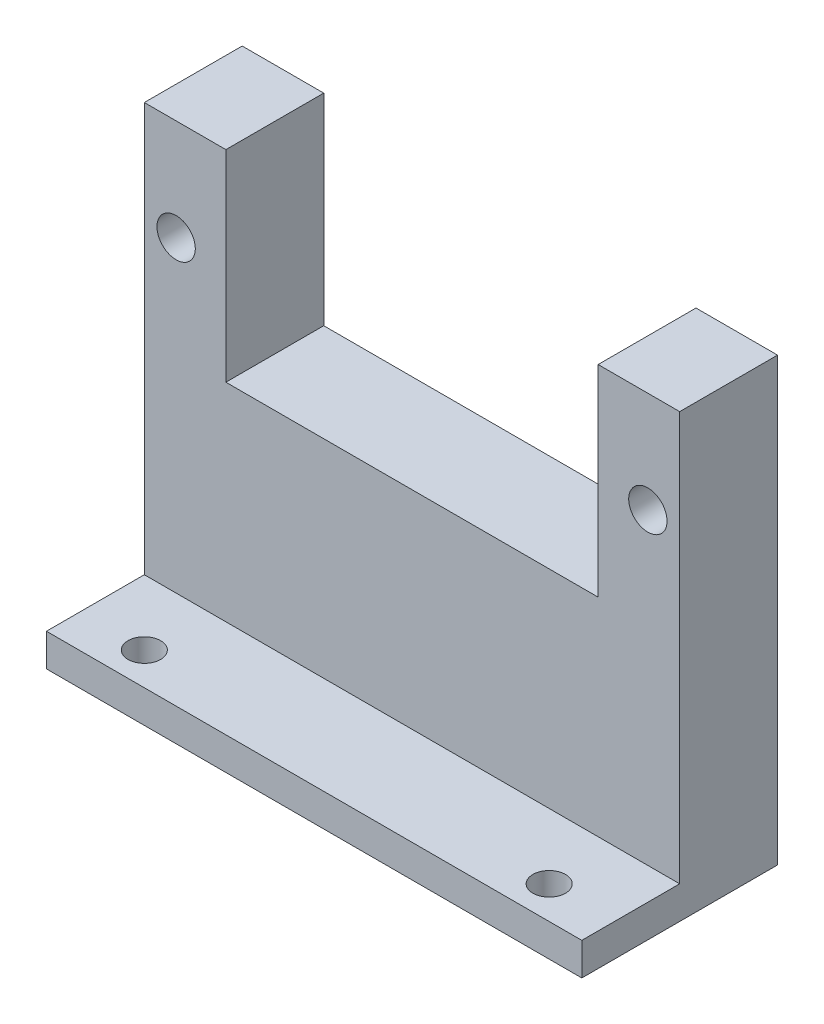
ISO-10303-21;
HEADER;
FILE_DESCRIPTION(('STEP AP214'),'2;1');
FILE_NAME('part.step','',(''),(''),'','','');
FILE_SCHEMA(('AUTOMOTIVE_DESIGN { 1 0 10303 214 1 1 1 1 }'));
ENDSEC;
DATA;
#1=APPLICATION_CONTEXT('core data for automotive mechanical design processes');
#2=APPLICATION_PROTOCOL_DEFINITION('international standard','automotive_design',2000,#1);
#3=PRODUCT_CONTEXT('',#1,'mechanical');
#4=PRODUCT('Part','Part','',(#3));
#5=PRODUCT_RELATED_PRODUCT_CATEGORY('part','',(#4));
#6=PRODUCT_DEFINITION_FORMATION('','',#4);
#7=PRODUCT_DEFINITION_CONTEXT('part definition',#1,'design');
#8=PRODUCT_DEFINITION('design','',#6,#7);
#9=PRODUCT_DEFINITION_SHAPE('','',#8);
#10=(LENGTH_UNIT() NAMED_UNIT(*) SI_UNIT(.MILLI.,.METRE.));
#11=(NAMED_UNIT(*) PLANE_ANGLE_UNIT() SI_UNIT($,.RADIAN.));
#12=(NAMED_UNIT(*) SI_UNIT($,.STERADIAN.) SOLID_ANGLE_UNIT());
#13=UNCERTAINTY_MEASURE_WITH_UNIT(LENGTH_MEASURE(1.E-05),#10,'distance_accuracy_value','');
#14=(GEOMETRIC_REPRESENTATION_CONTEXT(3) GLOBAL_UNCERTAINTY_ASSIGNED_CONTEXT((#13)) GLOBAL_UNIT_ASSIGNED_CONTEXT((#10,
#11,#12)) REPRESENTATION_CONTEXT('',''));
#15=CARTESIAN_POINT('',(0.,0.,0.));
#16=DIRECTION('',(0.,0.,1.));
#17=DIRECTION('',(1.,0.,0.));
#18=AXIS2_PLACEMENT_3D('',#15,#16,#17);
#19=CARTESIAN_POINT('',(0.,0.,6.));
#20=DIRECTION('',(0.,0.,-1.));
#21=DIRECTION('',(-1.,0.,0.));
#22=AXIS2_PLACEMENT_3D('',#19,#20,#21);
#23=PLANE('',#22);
#24=CARTESIAN_POINT('',(1.95,20.87,6.));
#25=DIRECTION('',(0.,0.,1.));
#26=DIRECTION('',(-1.,0.,0.));
#27=AXIS2_PLACEMENT_3D('',#24,#25,#26);
#28=CIRCLE('',#27,1.175);
#29=CARTESIAN_POINT('',(0.774999999999999,20.87,6.));
#30=VERTEX_POINT('',#29);
#31=EDGE_CURVE('E197',#30,#30,#28,.T.);
#32=ORIENTED_EDGE('',*,*,#31,.F.);
#33=EDGE_LOOP('',(#32));
#34=FACE_BOUND('',#33,.T.);
#35=CARTESIAN_POINT('',(30.87,20.87,6.));
#36=DIRECTION('',(0.,0.,1.));
#37=DIRECTION('',(1.,0.,0.));
#38=AXIS2_PLACEMENT_3D('',#35,#36,#37);
#39=CIRCLE('',#38,1.17499999999999);
#40=CARTESIAN_POINT('',(32.045,20.87,6.));
#41=VERTEX_POINT('',#40);
#42=EDGE_CURVE('E139',#41,#41,#39,.T.);
#43=ORIENTED_EDGE('',*,*,#42,.F.);
#44=EDGE_LOOP('',(#43));
#45=FACE_BOUND('',#44,.T.);
#46=DIRECTION('',(-1.,0.,0.));
#47=VECTOR('',#46,1.);
#48=CARTESIAN_POINT('',(0.,2.,6.));
#49=LINE('',#48,#47);
#50=CARTESIAN_POINT('',(32.82,2.,6.));
#51=VERTEX_POINT('',#50);
#52=CARTESIAN_POINT('',(0.,2.,6.));
#53=VERTEX_POINT('',#52);
#54=EDGE_CURVE('E48',#51,#53,#49,.T.);
#55=ORIENTED_EDGE('',*,*,#54,.F.);
#56=DIRECTION('',(0.,1.,0.));
#57=VECTOR('',#56,1.);
#58=CARTESIAN_POINT('',(32.82,0.,6.));
#59=LINE('',#58,#57);
#60=CARTESIAN_POINT('',(32.82,27.07,6.));
#61=VERTEX_POINT('',#60);
#62=EDGE_CURVE('E95',#51,#61,#59,.T.);
#63=ORIENTED_EDGE('',*,*,#62,.T.);
#64=DIRECTION('',(-1.,0.,0.));
#65=VECTOR('',#64,1.);
#66=CARTESIAN_POINT('',(32.82,27.07,6.));
#67=LINE('',#66,#65);
#68=CARTESIAN_POINT('',(27.82,27.07,6.));
#69=VERTEX_POINT('',#68);
#70=EDGE_CURVE('E209',#61,#69,#67,.T.);
#71=ORIENTED_EDGE('',*,*,#70,.T.);
#72=DIRECTION('',(0.,-1.,0.));
#73=VECTOR('',#72,1.);
#74=CARTESIAN_POINT('',(27.82,14.72,6.));
#75=LINE('',#74,#73);
#76=CARTESIAN_POINT('',(27.82,14.72,6.));
#77=VERTEX_POINT('',#76);
#78=EDGE_CURVE('E112',#69,#77,#75,.T.);
#79=ORIENTED_EDGE('',*,*,#78,.T.);
#80=DIRECTION('',(-1.,0.,0.));
#81=VECTOR('',#80,1.);
#82=CARTESIAN_POINT('',(5.,14.72,6.));
#83=LINE('',#82,#81);
#84=CARTESIAN_POINT('',(5.,14.72,6.));
#85=VERTEX_POINT('',#84);
#86=EDGE_CURVE('E106',#77,#85,#83,.T.);
#87=ORIENTED_EDGE('',*,*,#86,.T.);
#88=DIRECTION('',(0.,1.,0.));
#89=VECTOR('',#88,1.);
#90=CARTESIAN_POINT('',(5.,14.72,6.));
#91=LINE('',#90,#89);
#92=CARTESIAN_POINT('',(5.,27.07,6.));
#93=VERTEX_POINT('',#92);
#94=EDGE_CURVE('E109',#85,#93,#91,.T.);
#95=ORIENTED_EDGE('',*,*,#94,.T.);
#96=DIRECTION('',(-1.,0.,0.));
#97=VECTOR('',#96,1.);
#98=CARTESIAN_POINT('',(0.,27.07,6.));
#99=LINE('',#98,#97);
#100=CARTESIAN_POINT('',(0.,27.07,6.));
#101=VERTEX_POINT('',#100);
#102=EDGE_CURVE('E129',#93,#101,#99,.T.);
#103=ORIENTED_EDGE('',*,*,#102,.T.);
#104=DIRECTION('',(0.,-1.,0.));
#105=VECTOR('',#104,1.);
#106=CARTESIAN_POINT('',(0.,0.,6.));
#107=LINE('',#106,#105);
#108=EDGE_CURVE('E56',#101,#53,#107,.T.);
#109=ORIENTED_EDGE('',*,*,#108,.T.);
#110=EDGE_LOOP('',(#55,#63,#71,#79,#87,#95,#103,#109));
#111=FACE_BOUND('',#110,.T.);
#112=ADVANCED_FACE('F33',(#34,#45,#111),#23,.F.);
#113=CARTESIAN_POINT('',(0.,0.,0.));
#114=DIRECTION('',(0.,0.,-1.));
#115=DIRECTION('',(-1.,0.,0.));
#116=AXIS2_PLACEMENT_3D('',#113,#114,#115);
#117=PLANE('',#116);
#118=CARTESIAN_POINT('',(30.87,20.87,0.));
#119=DIRECTION('',(0.,0.,1.));
#120=DIRECTION('',(1.,0.,0.));
#121=AXIS2_PLACEMENT_3D('',#118,#119,#120);
#122=CIRCLE('',#121,1.17499999999999);
#123=CARTESIAN_POINT('',(32.045,20.87,0.));
#124=VERTEX_POINT('',#123);
#125=EDGE_CURVE('E200',#124,#124,#122,.T.);
#126=ORIENTED_EDGE('',*,*,#125,.T.);
#127=EDGE_LOOP('',(#126));
#128=FACE_BOUND('',#127,.T.);
#129=DIRECTION('',(1.,0.,0.));
#130=VECTOR('',#129,1.);
#131=CARTESIAN_POINT('',(0.,0.,0.));
#132=LINE('',#131,#130);
#133=CARTESIAN_POINT('',(0.,0.,0.));
#134=VERTEX_POINT('',#133);
#135=CARTESIAN_POINT('',(32.82,0.,0.));
#136=VERTEX_POINT('',#135);
#137=EDGE_CURVE('E135',#134,#136,#132,.T.);
#138=ORIENTED_EDGE('',*,*,#137,.F.);
#139=DIRECTION('',(0.,-1.,0.));
#140=VECTOR('',#139,1.);
#141=CARTESIAN_POINT('',(0.,20.,0.));
#142=LINE('',#141,#140);
#143=CARTESIAN_POINT('',(0.,27.07,0.));
#144=VERTEX_POINT('',#143);
#145=EDGE_CURVE('E149',#144,#134,#142,.T.);
#146=ORIENTED_EDGE('',*,*,#145,.F.);
#147=DIRECTION('',(-1.,0.,0.));
#148=VECTOR('',#147,1.);
#149=CARTESIAN_POINT('',(0.,27.07,0.));
#150=LINE('',#149,#148);
#151=CARTESIAN_POINT('',(5.,27.07,0.));
#152=VERTEX_POINT('',#151);
#153=EDGE_CURVE('E91',#152,#144,#150,.T.);
#154=ORIENTED_EDGE('',*,*,#153,.F.);
#155=DIRECTION('',(0.,1.,0.));
#156=VECTOR('',#155,1.);
#157=CARTESIAN_POINT('',(5.,14.72,0.));
#158=LINE('',#157,#156);
#159=CARTESIAN_POINT('',(5.,14.72,0.));
#160=VERTEX_POINT('',#159);
#161=EDGE_CURVE('E146',#160,#152,#158,.T.);
#162=ORIENTED_EDGE('',*,*,#161,.F.);
#163=DIRECTION('',(-1.,0.,0.));
#164=VECTOR('',#163,1.);
#165=CARTESIAN_POINT('',(5.,14.72,0.));
#166=LINE('',#165,#164);
#167=CARTESIAN_POINT('',(27.82,14.72,0.));
#168=VERTEX_POINT('',#167);
#169=EDGE_CURVE('E121',#168,#160,#166,.T.);
#170=ORIENTED_EDGE('',*,*,#169,.F.);
#171=DIRECTION('',(0.,-1.,0.));
#172=VECTOR('',#171,1.);
#173=CARTESIAN_POINT('',(27.82,14.72,0.));
#174=LINE('',#173,#172);
#175=CARTESIAN_POINT('',(27.82,27.07,0.));
#176=VERTEX_POINT('',#175);
#177=EDGE_CURVE('E143',#176,#168,#174,.T.);
#178=ORIENTED_EDGE('',*,*,#177,.F.);
#179=DIRECTION('',(-1.,0.,0.));
#180=VECTOR('',#179,1.);
#181=CARTESIAN_POINT('',(32.82,27.07,0.));
#182=LINE('',#181,#180);
#183=CARTESIAN_POINT('',(32.82,27.07,0.));
#184=VERTEX_POINT('',#183);
#185=EDGE_CURVE('E141',#184,#176,#182,.T.);
#186=ORIENTED_EDGE('',*,*,#185,.F.);
#187=DIRECTION('',(0.,1.,0.));
#188=VECTOR('',#187,1.);
#189=CARTESIAN_POINT('',(32.82,14.72,0.));
#190=LINE('',#189,#188);
#191=EDGE_CURVE('E138',#136,#184,#190,.T.);
#192=ORIENTED_EDGE('',*,*,#191,.F.);
#193=EDGE_LOOP('',(#138,#146,#154,#162,#170,#178,#186,#192));
#194=FACE_BOUND('',#193,.T.);
#195=CARTESIAN_POINT('',(1.95,20.87,0.));
#196=DIRECTION('',(0.,0.,1.));
#197=DIRECTION('',(-1.,0.,0.));
#198=AXIS2_PLACEMENT_3D('',#195,#196,#197);
#199=CIRCLE('',#198,1.175);
#200=CARTESIAN_POINT('',(0.774999999999999,20.87,0.));
#201=VERTEX_POINT('',#200);
#202=EDGE_CURVE('E196',#201,#201,#199,.T.);
#203=ORIENTED_EDGE('',*,*,#202,.T.);
#204=EDGE_LOOP('',(#203));
#205=FACE_BOUND('',#204,.T.);
#206=ADVANCED_FACE('F219',(#128,#194,#205),#117,.T.);
#207=CARTESIAN_POINT('',(0.,0.,6.));
#208=DIRECTION('',(0.,1.,0.));
#209=DIRECTION('',(-1.,0.,0.));
#210=AXIS2_PLACEMENT_3D('',#207,#208,#209);
#211=PLANE('',#210);
#212=ORIENTED_EDGE('',*,*,#137,.T.);
#213=DIRECTION('',(0.,0.,-1.));
#214=VECTOR('',#213,1.);
#215=CARTESIAN_POINT('',(32.82,0.,6.));
#216=LINE('',#215,#214);
#217=CARTESIAN_POINT('',(32.82,0.,12.));
#218=VERTEX_POINT('',#217);
#219=EDGE_CURVE('E41',#218,#136,#216,.T.);
#220=ORIENTED_EDGE('',*,*,#219,.F.);
#221=DIRECTION('',(1.,0.,0.));
#222=VECTOR('',#221,1.);
#223=CARTESIAN_POINT('',(0.,0.,12.));
#224=LINE('',#223,#222);
#225=CARTESIAN_POINT('',(0.,0.,12.));
#226=VERTEX_POINT('',#225);
#227=EDGE_CURVE('E172',#226,#218,#224,.T.);
#228=ORIENTED_EDGE('',*,*,#227,.F.);
#229=DIRECTION('',(0.,0.,-1.));
#230=VECTOR('',#229,1.);
#231=CARTESIAN_POINT('',(0.,0.,6.));
#232=LINE('',#231,#230);
#233=EDGE_CURVE('E11',#226,#134,#232,.T.);
#234=ORIENTED_EDGE('',*,*,#233,.T.);
#235=EDGE_LOOP('',(#212,#220,#228,#234));
#236=FACE_BOUND('',#235,.T.);
#237=CARTESIAN_POINT('',(4.,0.,10.));
#238=DIRECTION('',(0.,1.,0.));
#239=DIRECTION('',(0.,0.,1.));
#240=AXIS2_PLACEMENT_3D('',#237,#238,#239);
#241=CIRCLE('',#240,1.);
#242=CARTESIAN_POINT('',(4.,0.,11.));
#243=VERTEX_POINT('',#242);
#244=EDGE_CURVE('E189',#243,#243,#241,.T.);
#245=ORIENTED_EDGE('',*,*,#244,.T.);
#246=EDGE_LOOP('',(#245));
#247=FACE_BOUND('',#246,.T.);
#248=CARTESIAN_POINT('',(28.82,0.,10.));
#249=DIRECTION('',(0.,1.,0.));
#250=DIRECTION('',(0.,0.,1.));
#251=AXIS2_PLACEMENT_3D('',#248,#249,#250);
#252=CIRCLE('',#251,1.);
#253=CARTESIAN_POINT('',(28.82,0.,11.));
#254=VERTEX_POINT('',#253);
#255=EDGE_CURVE('E239',#254,#254,#252,.T.);
#256=ORIENTED_EDGE('',*,*,#255,.T.);
#257=EDGE_LOOP('',(#256));
#258=FACE_BOUND('',#257,.T.);
#259=ADVANCED_FACE('F35',(#236,#247,#258),#211,.F.);
#260=CARTESIAN_POINT('',(32.82,14.72,6.));
#261=DIRECTION('',(-1.,0.,0.));
#262=DIRECTION('',(0.,-1.,0.));
#263=AXIS2_PLACEMENT_3D('',#260,#261,#262);
#264=PLANE('',#263);
#265=ORIENTED_EDGE('',*,*,#191,.T.);
#266=DIRECTION('',(0.,0.,-1.));
#267=VECTOR('',#266,1.);
#268=CARTESIAN_POINT('',(32.82,27.07,6.));
#269=LINE('',#268,#267);
#270=EDGE_CURVE('E157',#61,#184,#269,.T.);
#271=ORIENTED_EDGE('',*,*,#270,.F.);
#272=ORIENTED_EDGE('',*,*,#62,.F.);
#273=DIRECTION('',(0.,0.,-1.));
#274=VECTOR('',#273,1.);
#275=CARTESIAN_POINT('',(32.82,2.,6.));
#276=LINE('',#275,#274);
#277=CARTESIAN_POINT('',(32.82,2.,12.));
#278=VERTEX_POINT('',#277);
#279=EDGE_CURVE('E229',#278,#51,#276,.T.);
#280=ORIENTED_EDGE('',*,*,#279,.F.);
#281=DIRECTION('',(0.,-1.,0.));
#282=VECTOR('',#281,1.);
#283=CARTESIAN_POINT('',(32.82,2.,12.));
#284=LINE('',#283,#282);
#285=EDGE_CURVE('E166',#278,#218,#284,.T.);
#286=ORIENTED_EDGE('',*,*,#285,.T.);
#287=ORIENTED_EDGE('',*,*,#219,.T.);
#288=EDGE_LOOP('',(#265,#271,#272,#280,#286,#287));
#289=FACE_BOUND('',#288,.T.);
#290=ADVANCED_FACE('F163',(#289),#264,.F.);
#291=CARTESIAN_POINT('',(32.82,27.07,6.));
#292=DIRECTION('',(0.,-1.,0.));
#293=DIRECTION('',(1.,0.,0.));
#294=AXIS2_PLACEMENT_3D('',#291,#292,#293);
#295=PLANE('',#294);
#296=ORIENTED_EDGE('',*,*,#185,.T.);
#297=DIRECTION('',(0.,0.,-1.));
#298=VECTOR('',#297,1.);
#299=CARTESIAN_POINT('',(27.82,27.07,6.));
#300=LINE('',#299,#298);
#301=EDGE_CURVE('E154',#69,#176,#300,.T.);
#302=ORIENTED_EDGE('',*,*,#301,.F.);
#303=ORIENTED_EDGE('',*,*,#70,.F.);
#304=ORIENTED_EDGE('',*,*,#270,.T.);
#305=EDGE_LOOP('',(#296,#302,#303,#304));
#306=FACE_BOUND('',#305,.T.);
#307=ADVANCED_FACE('F213',(#306),#295,.F.);
#308=CARTESIAN_POINT('',(27.82,14.72,6.));
#309=DIRECTION('',(1.,0.,0.));
#310=DIRECTION('',(0.,0.,-1.));
#311=AXIS2_PLACEMENT_3D('',#308,#309,#310);
#312=PLANE('',#311);
#313=ORIENTED_EDGE('',*,*,#177,.T.);
#314=DIRECTION('',(0.,0.,-1.));
#315=VECTOR('',#314,1.);
#316=CARTESIAN_POINT('',(27.82,14.72,6.));
#317=LINE('',#316,#315);
#318=EDGE_CURVE('E124',#77,#168,#317,.T.);
#319=ORIENTED_EDGE('',*,*,#318,.F.);
#320=ORIENTED_EDGE('',*,*,#78,.F.);
#321=ORIENTED_EDGE('',*,*,#301,.T.);
#322=EDGE_LOOP('',(#313,#319,#320,#321));
#323=FACE_BOUND('',#322,.T.);
#324=ADVANCED_FACE('F217',(#323),#312,.F.);
#325=CARTESIAN_POINT('',(5.,14.72,6.));
#326=DIRECTION('',(0.,-1.,0.));
#327=DIRECTION('',(0.,0.,-1.));
#328=AXIS2_PLACEMENT_3D('',#325,#326,#327);
#329=PLANE('',#328);
#330=ORIENTED_EDGE('',*,*,#169,.T.);
#331=DIRECTION('',(0.,0.,-1.));
#332=VECTOR('',#331,1.);
#333=CARTESIAN_POINT('',(5.,14.72,6.));
#334=LINE('',#333,#332);
#335=EDGE_CURVE('E118',#85,#160,#334,.T.);
#336=ORIENTED_EDGE('',*,*,#335,.F.);
#337=ORIENTED_EDGE('',*,*,#86,.F.);
#338=ORIENTED_EDGE('',*,*,#318,.T.);
#339=EDGE_LOOP('',(#330,#336,#337,#338));
#340=FACE_BOUND('',#339,.T.);
#341=ADVANCED_FACE('F119',(#340),#329,.F.);
#342=CARTESIAN_POINT('',(5.,14.72,6.));
#343=DIRECTION('',(-1.,0.,0.));
#344=DIRECTION('',(0.,0.,1.));
#345=AXIS2_PLACEMENT_3D('',#342,#343,#344);
#346=PLANE('',#345);
#347=ORIENTED_EDGE('',*,*,#161,.T.);
#348=DIRECTION('',(0.,0.,-1.));
#349=VECTOR('',#348,1.);
#350=CARTESIAN_POINT('',(5.,27.07,6.));
#351=LINE('',#350,#349);
#352=EDGE_CURVE('E125',#93,#152,#351,.T.);
#353=ORIENTED_EDGE('',*,*,#352,.F.);
#354=ORIENTED_EDGE('',*,*,#94,.F.);
#355=ORIENTED_EDGE('',*,*,#335,.T.);
#356=EDGE_LOOP('',(#347,#353,#354,#355));
#357=FACE_BOUND('',#356,.T.);
#358=ADVANCED_FACE('F127',(#357),#346,.F.);
#359=CARTESIAN_POINT('',(0.,27.07,6.));
#360=DIRECTION('',(0.,-1.,0.));
#361=DIRECTION('',(0.,0.,-1.));
#362=AXIS2_PLACEMENT_3D('',#359,#360,#361);
#363=PLANE('',#362);
#364=ORIENTED_EDGE('',*,*,#153,.T.);
#365=DIRECTION('',(0.,0.,-1.));
#366=VECTOR('',#365,1.);
#367=CARTESIAN_POINT('',(0.,27.07,6.));
#368=LINE('',#367,#366);
#369=EDGE_CURVE('E131',#101,#144,#368,.T.);
#370=ORIENTED_EDGE('',*,*,#369,.F.);
#371=ORIENTED_EDGE('',*,*,#102,.F.);
#372=ORIENTED_EDGE('',*,*,#352,.T.);
#373=EDGE_LOOP('',(#364,#370,#371,#372));
#374=FACE_BOUND('',#373,.T.);
#375=ADVANCED_FACE('F222',(#374),#363,.F.);
#376=CARTESIAN_POINT('',(0.,20.,6.));
#377=DIRECTION('',(1.,0.,0.));
#378=DIRECTION('',(0.,0.,-1.));
#379=AXIS2_PLACEMENT_3D('',#376,#377,#378);
#380=PLANE('',#379);
#381=ORIENTED_EDGE('',*,*,#145,.T.);
#382=ORIENTED_EDGE('',*,*,#233,.F.);
#383=DIRECTION('',(0.,-1.,0.));
#384=VECTOR('',#383,1.);
#385=CARTESIAN_POINT('',(0.,2.,12.));
#386=LINE('',#385,#384);
#387=CARTESIAN_POINT('',(0.,2.,12.));
#388=VERTEX_POINT('',#387);
#389=EDGE_CURVE('E181',#388,#226,#386,.T.);
#390=ORIENTED_EDGE('',*,*,#389,.F.);
#391=DIRECTION('',(0.,0.,1.));
#392=VECTOR('',#391,1.);
#393=CARTESIAN_POINT('',(0.,2.,6.));
#394=LINE('',#393,#392);
#395=EDGE_CURVE('E182',#53,#388,#394,.T.);
#396=ORIENTED_EDGE('',*,*,#395,.F.);
#397=ORIENTED_EDGE('',*,*,#108,.F.);
#398=ORIENTED_EDGE('',*,*,#369,.T.);
#399=EDGE_LOOP('',(#381,#382,#390,#396,#397,#398));
#400=FACE_BOUND('',#399,.T.);
#401=ADVANCED_FACE('F230',(#400),#380,.F.);
#402=CARTESIAN_POINT('',(30.87,20.87,6.));
#403=DIRECTION('',(0.,0.,-1.));
#404=DIRECTION('',(-1.,0.,0.));
#405=AXIS2_PLACEMENT_3D('',#402,#403,#404);
#406=CYLINDRICAL_SURFACE('',#405,1.17499999999999);
#407=ORIENTED_EDGE('',*,*,#42,.T.);
#408=EDGE_LOOP('',(#407));
#409=FACE_BOUND('',#408,.T.);
#410=ORIENTED_EDGE('',*,*,#125,.F.);
#411=EDGE_LOOP('',(#410));
#412=FACE_BOUND('',#411,.T.);
#413=ADVANCED_FACE('F257',(#409,#412),#406,.F.);
#414=CARTESIAN_POINT('',(1.95,20.87,6.));
#415=DIRECTION('',(0.,0.,-1.));
#416=DIRECTION('',(-1.,0.,0.));
#417=AXIS2_PLACEMENT_3D('',#414,#415,#416);
#418=CYLINDRICAL_SURFACE('',#417,1.175);
#419=ORIENTED_EDGE('',*,*,#31,.T.);
#420=EDGE_LOOP('',(#419));
#421=FACE_BOUND('',#420,.T.);
#422=ORIENTED_EDGE('',*,*,#202,.F.);
#423=EDGE_LOOP('',(#422));
#424=FACE_BOUND('',#423,.T.);
#425=ADVANCED_FACE('F248',(#421,#424),#418,.F.);
#426=CARTESIAN_POINT('',(0.,2.,0.));
#427=DIRECTION('',(0.,1.,0.));
#428=DIRECTION('',(0.,0.,1.));
#429=AXIS2_PLACEMENT_3D('',#426,#427,#428);
#430=PLANE('',#429);
#431=CARTESIAN_POINT('',(4.,2.,10.));
#432=DIRECTION('',(0.,1.,0.));
#433=DIRECTION('',(0.,0.,1.));
#434=AXIS2_PLACEMENT_3D('',#431,#432,#433);
#435=CIRCLE('',#434,1.);
#436=CARTESIAN_POINT('',(4.,2.,11.));
#437=VERTEX_POINT('',#436);
#438=EDGE_CURVE('E183',#437,#437,#435,.T.);
#439=ORIENTED_EDGE('',*,*,#438,.F.);
#440=EDGE_LOOP('',(#439));
#441=FACE_BOUND('',#440,.T.);
#442=ORIENTED_EDGE('',*,*,#395,.T.);
#443=DIRECTION('',(1.,0.,0.));
#444=VECTOR('',#443,1.);
#445=CARTESIAN_POINT('',(0.,2.,12.));
#446=LINE('',#445,#444);
#447=EDGE_CURVE('E186',#388,#278,#446,.T.);
#448=ORIENTED_EDGE('',*,*,#447,.T.);
#449=ORIENTED_EDGE('',*,*,#279,.T.);
#450=ORIENTED_EDGE('',*,*,#54,.T.);
#451=EDGE_LOOP('',(#442,#448,#449,#450));
#452=FACE_BOUND('',#451,.T.);
#453=CARTESIAN_POINT('',(28.82,2.,10.));
#454=DIRECTION('',(0.,1.,0.));
#455=DIRECTION('',(0.,0.,1.));
#456=AXIS2_PLACEMENT_3D('',#453,#454,#455);
#457=CIRCLE('',#456,1.);
#458=CARTESIAN_POINT('',(28.82,2.,11.));
#459=VERTEX_POINT('',#458);
#460=EDGE_CURVE('E237',#459,#459,#457,.T.);
#461=ORIENTED_EDGE('',*,*,#460,.F.);
#462=EDGE_LOOP('',(#461));
#463=FACE_BOUND('',#462,.T.);
#464=ADVANCED_FACE('F226',(#441,#452,#463),#430,.T.);
#465=CARTESIAN_POINT('',(0.,2.,12.));
#466=DIRECTION('',(0.,0.,-1.));
#467=DIRECTION('',(-1.,0.,0.));
#468=AXIS2_PLACEMENT_3D('',#465,#466,#467);
#469=PLANE('',#468);
#470=ORIENTED_EDGE('',*,*,#227,.T.);
#471=ORIENTED_EDGE('',*,*,#285,.F.);
#472=ORIENTED_EDGE('',*,*,#447,.F.);
#473=ORIENTED_EDGE('',*,*,#389,.T.);
#474=EDGE_LOOP('',(#470,#471,#472,#473));
#475=FACE_BOUND('',#474,.T.);
#476=ADVANCED_FACE('F177',(#475),#469,.F.);
#477=CARTESIAN_POINT('',(4.,2.,10.));
#478=DIRECTION('',(0.,-1.,0.));
#479=DIRECTION('',(0.,0.,-1.));
#480=AXIS2_PLACEMENT_3D('',#477,#478,#479);
#481=CYLINDRICAL_SURFACE('',#480,1.);
#482=ORIENTED_EDGE('',*,*,#438,.T.);
#483=EDGE_LOOP('',(#482));
#484=FACE_BOUND('',#483,.T.);
#485=ORIENTED_EDGE('',*,*,#244,.F.);
#486=EDGE_LOOP('',(#485));
#487=FACE_BOUND('',#486,.T.);
#488=ADVANCED_FACE('F255',(#484,#487),#481,.F.);
#489=CARTESIAN_POINT('',(28.82,2.,10.));
#490=DIRECTION('',(0.,-1.,0.));
#491=DIRECTION('',(0.,0.,-1.));
#492=AXIS2_PLACEMENT_3D('',#489,#490,#491);
#493=CYLINDRICAL_SURFACE('',#492,1.);
#494=ORIENTED_EDGE('',*,*,#460,.T.);
#495=EDGE_LOOP('',(#494));
#496=FACE_BOUND('',#495,.T.);
#497=ORIENTED_EDGE('',*,*,#255,.F.);
#498=EDGE_LOOP('',(#497));
#499=FACE_BOUND('',#498,.T.);
#500=ADVANCED_FACE('F245',(#496,#499),#493,.F.);
#501=CLOSED_SHELL('',(#112,#206,#259,#290,#307,#324,#341,#358,#375,#401,#413,#425,#464,#476,
#488,#500));
#502=MANIFOLD_SOLID_BREP('B2',#501);
#503=ADVANCED_BREP_SHAPE_REPRESENTATION('',(#18,#502),#14);
#504=SHAPE_DEFINITION_REPRESENTATION(#9,#503);
ENDSEC;
END-ISO-10303-21;
